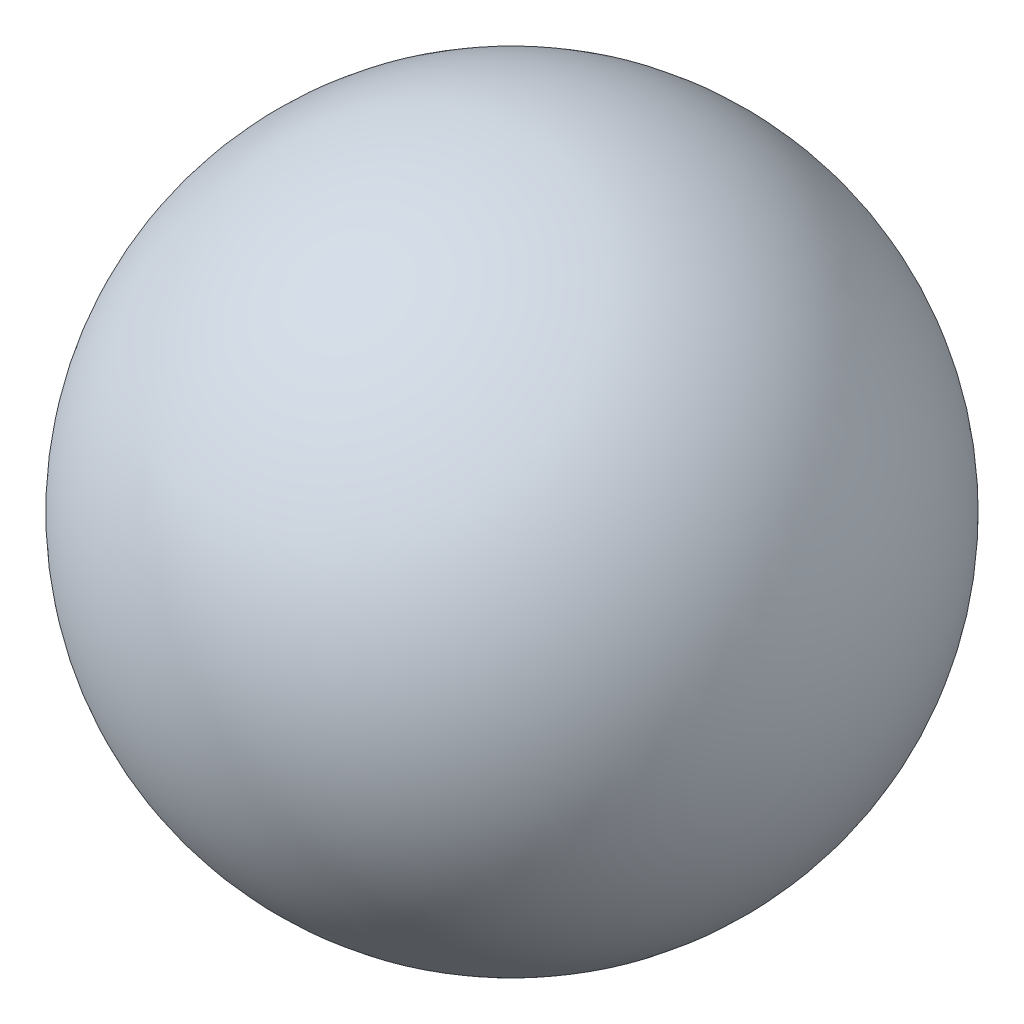
ISO-10303-21;
HEADER;
FILE_DESCRIPTION(('STEP AP214'),'2;1');
FILE_NAME('part.step','',(''),(''),'','','');
FILE_SCHEMA(('AUTOMOTIVE_DESIGN { 1 0 10303 214 1 1 1 1 }'));
ENDSEC;
DATA;
#1=APPLICATION_CONTEXT('core data for automotive mechanical design processes');
#2=APPLICATION_PROTOCOL_DEFINITION('international standard','automotive_design',2000,#1);
#3=PRODUCT_CONTEXT('',#1,'mechanical');
#4=PRODUCT('Part','Part','',(#3));
#5=PRODUCT_RELATED_PRODUCT_CATEGORY('part','',(#4));
#6=PRODUCT_DEFINITION_FORMATION('','',#4);
#7=PRODUCT_DEFINITION_CONTEXT('part definition',#1,'design');
#8=PRODUCT_DEFINITION('design','',#6,#7);
#9=PRODUCT_DEFINITION_SHAPE('','',#8);
#10=(LENGTH_UNIT() NAMED_UNIT(*) SI_UNIT(.MILLI.,.METRE.));
#11=(NAMED_UNIT(*) PLANE_ANGLE_UNIT() SI_UNIT($,.RADIAN.));
#12=(NAMED_UNIT(*) SI_UNIT($,.STERADIAN.) SOLID_ANGLE_UNIT());
#13=UNCERTAINTY_MEASURE_WITH_UNIT(LENGTH_MEASURE(1.E-05),#10,'distance_accuracy_value','');
#14=(GEOMETRIC_REPRESENTATION_CONTEXT(3) GLOBAL_UNCERTAINTY_ASSIGNED_CONTEXT((#13)) GLOBAL_UNIT_ASSIGNED_CONTEXT((#10,
#11,#12)) REPRESENTATION_CONTEXT('',''));
#15=CARTESIAN_POINT('',(0.,0.,0.));
#16=DIRECTION('',(0.,0.,1.));
#17=DIRECTION('',(1.,0.,0.));
#18=AXIS2_PLACEMENT_3D('',#15,#16,#17);
#19=CARTESIAN_POINT('',(0.,0.,0.));
#20=DIRECTION('',(0.,1.,0.));
#21=DIRECTION('',(0.,0.,-1.));
#22=AXIS2_PLACEMENT_3D('',#19,#20,#21);
#23=SPHERICAL_SURFACE('',#22,3.5);
#24=CARTESIAN_POINT('',(0.,3.5,0.));
#25=VERTEX_POINT('',#24);
#26=VERTEX_LOOP('',#25);
#27=FACE_BOUND('',#26,.T.);
#28=ADVANCED_FACE('F25',(#27),#23,.T.);
#29=CLOSED_SHELL('',(#28));
#30=MANIFOLD_SOLID_BREP('B2',#29);
#31=ADVANCED_BREP_SHAPE_REPRESENTATION('',(#18,#30),#14);
#32=SHAPE_DEFINITION_REPRESENTATION(#9,#31);
ENDSEC;
END-ISO-10303-21;
